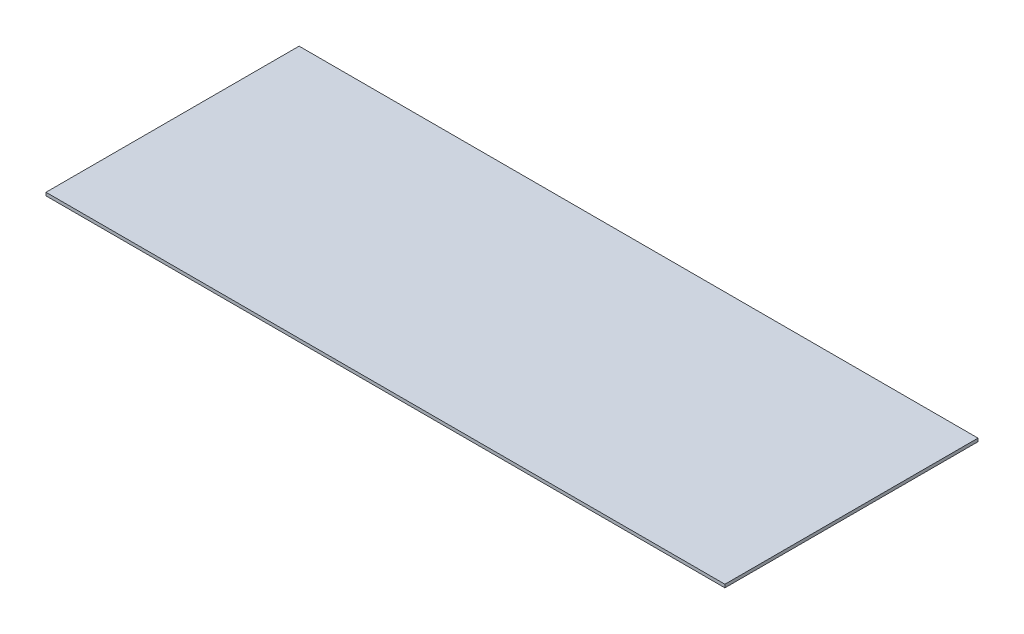
ISO-10303-21;
HEADER;
FILE_DESCRIPTION(('STEP AP214'),'2;1');
FILE_NAME('part.step','',(''),(''),'','','');
FILE_SCHEMA(('AUTOMOTIVE_DESIGN { 1 0 10303 214 1 1 1 1 }'));
ENDSEC;
DATA;
#1=APPLICATION_CONTEXT('core data for automotive mechanical design processes');
#2=APPLICATION_PROTOCOL_DEFINITION('international standard','automotive_design',2000,#1);
#3=PRODUCT_CONTEXT('',#1,'mechanical');
#4=PRODUCT('Part','Part','',(#3));
#5=PRODUCT_RELATED_PRODUCT_CATEGORY('part','',(#4));
#6=PRODUCT_DEFINITION_FORMATION('','',#4);
#7=PRODUCT_DEFINITION_CONTEXT('part definition',#1,'design');
#8=PRODUCT_DEFINITION('design','',#6,#7);
#9=PRODUCT_DEFINITION_SHAPE('','',#8);
#10=(LENGTH_UNIT() NAMED_UNIT(*) SI_UNIT(.MILLI.,.METRE.));
#11=(NAMED_UNIT(*) PLANE_ANGLE_UNIT() SI_UNIT($,.RADIAN.));
#12=(NAMED_UNIT(*) SI_UNIT($,.STERADIAN.) SOLID_ANGLE_UNIT());
#13=UNCERTAINTY_MEASURE_WITH_UNIT(LENGTH_MEASURE(1.E-05),#10,'distance_accuracy_value','');
#14=(GEOMETRIC_REPRESENTATION_CONTEXT(3) GLOBAL_UNCERTAINTY_ASSIGNED_CONTEXT((#13)) GLOBAL_UNIT_ASSIGNED_CONTEXT((#10,
#11,#12)) REPRESENTATION_CONTEXT('',''));
#15=CARTESIAN_POINT('',(0.,0.,0.));
#16=DIRECTION('',(0.,0.,1.));
#17=DIRECTION('',(1.,0.,0.));
#18=AXIS2_PLACEMENT_3D('',#15,#16,#17);
#19=CARTESIAN_POINT('',(-536.5,5.,200.));
#20=DIRECTION('',(1.,0.,0.));
#21=DIRECTION('',(0.,0.,-1.));
#22=AXIS2_PLACEMENT_3D('',#19,#20,#21);
#23=PLANE('',#22);
#24=DIRECTION('',(0.,0.,1.));
#25=VECTOR('',#24,1.);
#26=CARTESIAN_POINT('',(-536.5,0.,200.));
#27=LINE('',#26,#25);
#28=CARTESIAN_POINT('',(-536.5,0.,-200.));
#29=VERTEX_POINT('',#28);
#30=CARTESIAN_POINT('',(-536.5,0.,200.));
#31=VERTEX_POINT('',#30);
#32=EDGE_CURVE('E98',#29,#31,#27,.T.);
#33=ORIENTED_EDGE('',*,*,#32,.T.);
#34=DIRECTION('',(0.,-1.,0.));
#35=VECTOR('',#34,1.);
#36=CARTESIAN_POINT('',(-536.5,5.,200.));
#37=LINE('',#36,#35);
#38=CARTESIAN_POINT('',(-536.5,5.,200.));
#39=VERTEX_POINT('',#38);
#40=EDGE_CURVE('E11',#39,#31,#37,.T.);
#41=ORIENTED_EDGE('',*,*,#40,.F.);
#42=DIRECTION('',(0.,0.,1.));
#43=VECTOR('',#42,1.);
#44=CARTESIAN_POINT('',(-536.5,5.,200.));
#45=LINE('',#44,#43);
#46=CARTESIAN_POINT('',(-536.5,5.,-200.));
#47=VERTEX_POINT('',#46);
#48=EDGE_CURVE('E86',#47,#39,#45,.T.);
#49=ORIENTED_EDGE('',*,*,#48,.F.);
#50=DIRECTION('',(0.,-1.,0.));
#51=VECTOR('',#50,1.);
#52=CARTESIAN_POINT('',(-536.5,5.,-200.));
#53=LINE('',#52,#51);
#54=EDGE_CURVE('E94',#47,#29,#53,.T.);
#55=ORIENTED_EDGE('',*,*,#54,.T.);
#56=EDGE_LOOP('',(#33,#41,#49,#55));
#57=FACE_BOUND('',#56,.T.);
#58=ADVANCED_FACE('F35',(#57),#23,.F.);
#59=CARTESIAN_POINT('',(536.5,5.,200.));
#60=DIRECTION('',(0.,0.,-1.));
#61=DIRECTION('',(-1.,0.,0.));
#62=AXIS2_PLACEMENT_3D('',#59,#60,#61);
#63=PLANE('',#62);
#64=DIRECTION('',(1.,0.,0.));
#65=VECTOR('',#64,1.);
#66=CARTESIAN_POINT('',(536.5,0.,200.));
#67=LINE('',#66,#65);
#68=CARTESIAN_POINT('',(536.5,0.,200.));
#69=VERTEX_POINT('',#68);
#70=EDGE_CURVE('E90',#31,#69,#67,.T.);
#71=ORIENTED_EDGE('',*,*,#70,.T.);
#72=DIRECTION('',(0.,-1.,0.));
#73=VECTOR('',#72,1.);
#74=CARTESIAN_POINT('',(536.5,5.,200.));
#75=LINE('',#74,#73);
#76=CARTESIAN_POINT('',(536.5,5.,200.));
#77=VERTEX_POINT('',#76);
#78=EDGE_CURVE('E43',#77,#69,#75,.T.);
#79=ORIENTED_EDGE('',*,*,#78,.F.);
#80=DIRECTION('',(1.,0.,0.));
#81=VECTOR('',#80,1.);
#82=CARTESIAN_POINT('',(536.5,5.,200.));
#83=LINE('',#82,#81);
#84=EDGE_CURVE('E81',#39,#77,#83,.T.);
#85=ORIENTED_EDGE('',*,*,#84,.F.);
#86=ORIENTED_EDGE('',*,*,#40,.T.);
#87=EDGE_LOOP('',(#71,#79,#85,#86));
#88=FACE_BOUND('',#87,.T.);
#89=ADVANCED_FACE('F89',(#88),#63,.F.);
#90=CARTESIAN_POINT('',(536.5,5.,200.));
#91=DIRECTION('',(-1.,0.,0.));
#92=DIRECTION('',(0.,0.,1.));
#93=AXIS2_PLACEMENT_3D('',#90,#91,#92);
#94=PLANE('',#93);
#95=DIRECTION('',(0.,0.,-1.));
#96=VECTOR('',#95,1.);
#97=CARTESIAN_POINT('',(536.5,0.,200.));
#98=LINE('',#97,#96);
#99=CARTESIAN_POINT('',(536.5,0.,-200.));
#100=VERTEX_POINT('',#99);
#101=EDGE_CURVE('E68',#69,#100,#98,.T.);
#102=ORIENTED_EDGE('',*,*,#101,.T.);
#103=DIRECTION('',(0.,-1.,0.));
#104=VECTOR('',#103,1.);
#105=CARTESIAN_POINT('',(536.5,5.,-200.));
#106=LINE('',#105,#104);
#107=CARTESIAN_POINT('',(536.5,5.,-200.));
#108=VERTEX_POINT('',#107);
#109=EDGE_CURVE('E91',#108,#100,#106,.T.);
#110=ORIENTED_EDGE('',*,*,#109,.F.);
#111=DIRECTION('',(0.,0.,-1.));
#112=VECTOR('',#111,1.);
#113=CARTESIAN_POINT('',(536.5,5.,200.));
#114=LINE('',#113,#112);
#115=EDGE_CURVE('E84',#77,#108,#114,.T.);
#116=ORIENTED_EDGE('',*,*,#115,.F.);
#117=ORIENTED_EDGE('',*,*,#78,.T.);
#118=EDGE_LOOP('',(#102,#110,#116,#117));
#119=FACE_BOUND('',#118,.T.);
#120=ADVANCED_FACE('F92',(#119),#94,.F.);
#121=CARTESIAN_POINT('',(536.5,5.,-200.));
#122=DIRECTION('',(0.,0.,1.));
#123=DIRECTION('',(1.,0.,0.));
#124=AXIS2_PLACEMENT_3D('',#121,#122,#123);
#125=PLANE('',#124);
#126=DIRECTION('',(-1.,0.,0.));
#127=VECTOR('',#126,1.);
#128=CARTESIAN_POINT('',(536.5,0.,-200.));
#129=LINE('',#128,#127);
#130=EDGE_CURVE('E74',#100,#29,#129,.T.);
#131=ORIENTED_EDGE('',*,*,#130,.T.);
#132=ORIENTED_EDGE('',*,*,#54,.F.);
#133=DIRECTION('',(-1.,0.,0.));
#134=VECTOR('',#133,1.);
#135=CARTESIAN_POINT('',(536.5,5.,-200.));
#136=LINE('',#135,#134);
#137=EDGE_CURVE('E51',#108,#47,#136,.T.);
#138=ORIENTED_EDGE('',*,*,#137,.F.);
#139=ORIENTED_EDGE('',*,*,#109,.T.);
#140=EDGE_LOOP('',(#131,#132,#138,#139));
#141=FACE_BOUND('',#140,.T.);
#142=ADVANCED_FACE('F105',(#141),#125,.F.);
#143=CARTESIAN_POINT('',(-536.5,5.,-200.));
#144=DIRECTION('',(0.,1.,0.));
#145=DIRECTION('',(0.,0.,1.));
#146=AXIS2_PLACEMENT_3D('',#143,#144,#145);
#147=PLANE('',#146);
#148=ORIENTED_EDGE('',*,*,#48,.T.);
#149=ORIENTED_EDGE('',*,*,#84,.T.);
#150=ORIENTED_EDGE('',*,*,#115,.T.);
#151=ORIENTED_EDGE('',*,*,#137,.T.);
#152=EDGE_LOOP('',(#148,#149,#150,#151));
#153=FACE_BOUND('',#152,.T.);
#154=ADVANCED_FACE('F82',(#153),#147,.T.);
#155=CARTESIAN_POINT('',(-536.5,0.,-200.));
#156=DIRECTION('',(0.,1.,0.));
#157=DIRECTION('',(0.,0.,1.));
#158=AXIS2_PLACEMENT_3D('',#155,#156,#157);
#159=PLANE('',#158);
#160=ORIENTED_EDGE('',*,*,#32,.F.);
#161=ORIENTED_EDGE('',*,*,#130,.F.);
#162=ORIENTED_EDGE('',*,*,#101,.F.);
#163=ORIENTED_EDGE('',*,*,#70,.F.);
#164=EDGE_LOOP('',(#160,#161,#162,#163));
#165=FACE_BOUND('',#164,.T.);
#166=ADVANCED_FACE('F108',(#165),#159,.F.);
#167=CLOSED_SHELL('',(#58,#89,#120,#142,#154,#166));
#168=MANIFOLD_SOLID_BREP('B2',#167);
#169=ADVANCED_BREP_SHAPE_REPRESENTATION('',(#18,#168),#14);
#170=SHAPE_DEFINITION_REPRESENTATION(#9,#169);
ENDSEC;
END-ISO-10303-21;
